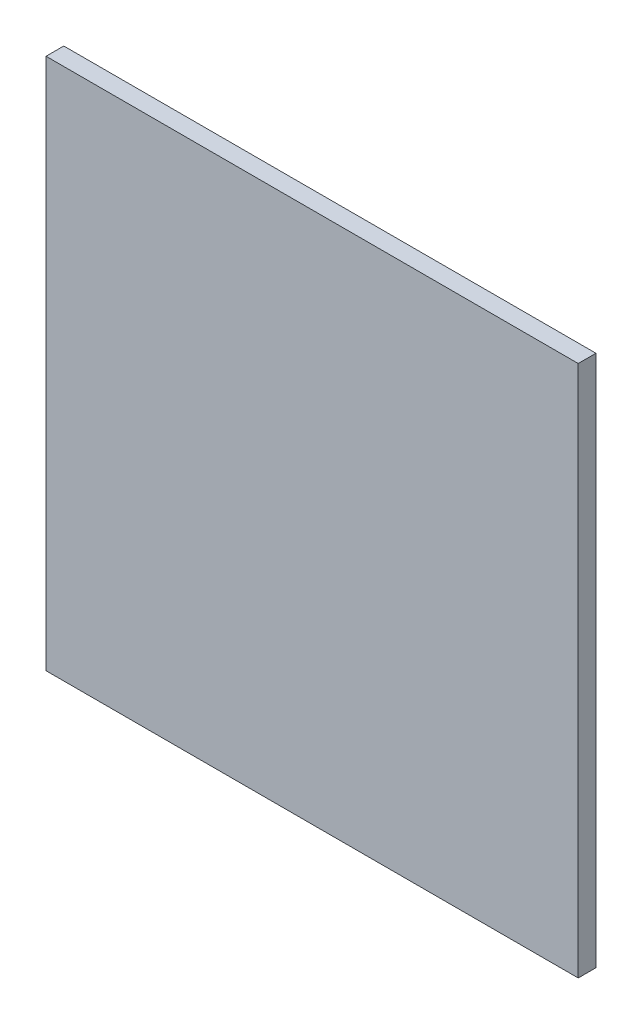
ISO-10303-21;
HEADER;
FILE_DESCRIPTION(('STEP AP214'),'2;1');
FILE_NAME('part.step','',(''),(''),'','','');
FILE_SCHEMA(('AUTOMOTIVE_DESIGN { 1 0 10303 214 1 1 1 1 }'));
ENDSEC;
DATA;
#1=APPLICATION_CONTEXT('core data for automotive mechanical design processes');
#2=APPLICATION_PROTOCOL_DEFINITION('international standard','automotive_design',2000,#1);
#3=PRODUCT_CONTEXT('',#1,'mechanical');
#4=PRODUCT('Part','Part','',(#3));
#5=PRODUCT_RELATED_PRODUCT_CATEGORY('part','',(#4));
#6=PRODUCT_DEFINITION_FORMATION('','',#4);
#7=PRODUCT_DEFINITION_CONTEXT('part definition',#1,'design');
#8=PRODUCT_DEFINITION('design','',#6,#7);
#9=PRODUCT_DEFINITION_SHAPE('','',#8);
#10=(LENGTH_UNIT() NAMED_UNIT(*) SI_UNIT(.MILLI.,.METRE.));
#11=(NAMED_UNIT(*) PLANE_ANGLE_UNIT() SI_UNIT($,.RADIAN.));
#12=(NAMED_UNIT(*) SI_UNIT($,.STERADIAN.) SOLID_ANGLE_UNIT());
#13=UNCERTAINTY_MEASURE_WITH_UNIT(LENGTH_MEASURE(1.E-05),#10,'distance_accuracy_value','');
#14=(GEOMETRIC_REPRESENTATION_CONTEXT(3) GLOBAL_UNCERTAINTY_ASSIGNED_CONTEXT((#13)) GLOBAL_UNIT_ASSIGNED_CONTEXT((#10,
#11,#12)) REPRESENTATION_CONTEXT('',''));
#15=CARTESIAN_POINT('',(0.,0.,0.));
#16=DIRECTION('',(0.,0.,1.));
#17=DIRECTION('',(1.,0.,0.));
#18=AXIS2_PLACEMENT_3D('',#15,#16,#17);
#19=CARTESIAN_POINT('',(900.,900.,60.));
#20=DIRECTION('',(-1.,0.,0.));
#21=DIRECTION('',(0.,-1.,0.));
#22=AXIS2_PLACEMENT_3D('',#19,#20,#21);
#23=PLANE('',#22);
#24=DIRECTION('',(0.,1.,0.));
#25=VECTOR('',#24,1.);
#26=CARTESIAN_POINT('',(900.,900.,0.));
#27=LINE('',#26,#25);
#28=CARTESIAN_POINT('',(900.,-900.,0.));
#29=VERTEX_POINT('',#28);
#30=CARTESIAN_POINT('',(900.,900.,0.));
#31=VERTEX_POINT('',#30);
#32=EDGE_CURVE('E102',#29,#31,#27,.T.);
#33=ORIENTED_EDGE('',*,*,#32,.T.);
#34=DIRECTION('',(0.,0.,-1.));
#35=VECTOR('',#34,1.);
#36=CARTESIAN_POINT('',(900.,900.,60.));
#37=LINE('',#36,#35);
#38=CARTESIAN_POINT('',(900.,900.,60.));
#39=VERTEX_POINT('',#38);
#40=EDGE_CURVE('E11',#39,#31,#37,.T.);
#41=ORIENTED_EDGE('',*,*,#40,.F.);
#42=DIRECTION('',(0.,1.,0.));
#43=VECTOR('',#42,1.);
#44=CARTESIAN_POINT('',(900.,900.,60.));
#45=LINE('',#44,#43);
#46=CARTESIAN_POINT('',(900.,-900.,60.));
#47=VERTEX_POINT('',#46);
#48=EDGE_CURVE('E90',#47,#39,#45,.T.);
#49=ORIENTED_EDGE('',*,*,#48,.F.);
#50=DIRECTION('',(0.,0.,-1.));
#51=VECTOR('',#50,1.);
#52=CARTESIAN_POINT('',(900.,-900.,60.));
#53=LINE('',#52,#51);
#54=EDGE_CURVE('E98',#47,#29,#53,.T.);
#55=ORIENTED_EDGE('',*,*,#54,.T.);
#56=EDGE_LOOP('',(#33,#41,#49,#55));
#57=FACE_BOUND('',#56,.T.);
#58=ADVANCED_FACE('F39',(#57),#23,.F.);
#59=CARTESIAN_POINT('',(-900.,900.,60.));
#60=DIRECTION('',(0.,-1.,0.));
#61=DIRECTION('',(0.,0.,-1.));
#62=AXIS2_PLACEMENT_3D('',#59,#60,#61);
#63=PLANE('',#62);
#64=DIRECTION('',(-1.,0.,0.));
#65=VECTOR('',#64,1.);
#66=CARTESIAN_POINT('',(-900.,900.,0.));
#67=LINE('',#66,#65);
#68=CARTESIAN_POINT('',(-900.,900.,0.));
#69=VERTEX_POINT('',#68);
#70=EDGE_CURVE('E94',#31,#69,#67,.T.);
#71=ORIENTED_EDGE('',*,*,#70,.T.);
#72=DIRECTION('',(0.,0.,-1.));
#73=VECTOR('',#72,1.);
#74=CARTESIAN_POINT('',(-900.,900.,60.));
#75=LINE('',#74,#73);
#76=CARTESIAN_POINT('',(-900.,900.,60.));
#77=VERTEX_POINT('',#76);
#78=EDGE_CURVE('E47',#77,#69,#75,.T.);
#79=ORIENTED_EDGE('',*,*,#78,.F.);
#80=DIRECTION('',(-1.,0.,0.));
#81=VECTOR('',#80,1.);
#82=CARTESIAN_POINT('',(-900.,900.,60.));
#83=LINE('',#82,#81);
#84=EDGE_CURVE('E85',#39,#77,#83,.T.);
#85=ORIENTED_EDGE('',*,*,#84,.F.);
#86=ORIENTED_EDGE('',*,*,#40,.T.);
#87=EDGE_LOOP('',(#71,#79,#85,#86));
#88=FACE_BOUND('',#87,.T.);
#89=ADVANCED_FACE('F93',(#88),#63,.F.);
#90=CARTESIAN_POINT('',(-900.,900.,60.));
#91=DIRECTION('',(1.,0.,0.));
#92=DIRECTION('',(0.,1.,0.));
#93=AXIS2_PLACEMENT_3D('',#90,#91,#92);
#94=PLANE('',#93);
#95=DIRECTION('',(0.,-1.,0.));
#96=VECTOR('',#95,1.);
#97=CARTESIAN_POINT('',(-900.,900.,0.));
#98=LINE('',#97,#96);
#99=CARTESIAN_POINT('',(-900.,-900.,0.));
#100=VERTEX_POINT('',#99);
#101=EDGE_CURVE('E72',#69,#100,#98,.T.);
#102=ORIENTED_EDGE('',*,*,#101,.T.);
#103=DIRECTION('',(0.,0.,-1.));
#104=VECTOR('',#103,1.);
#105=CARTESIAN_POINT('',(-900.,-900.,60.));
#106=LINE('',#105,#104);
#107=CARTESIAN_POINT('',(-900.,-900.,60.));
#108=VERTEX_POINT('',#107);
#109=EDGE_CURVE('E95',#108,#100,#106,.T.);
#110=ORIENTED_EDGE('',*,*,#109,.F.);
#111=DIRECTION('',(0.,-1.,0.));
#112=VECTOR('',#111,1.);
#113=CARTESIAN_POINT('',(-900.,900.,60.));
#114=LINE('',#113,#112);
#115=EDGE_CURVE('E88',#77,#108,#114,.T.);
#116=ORIENTED_EDGE('',*,*,#115,.F.);
#117=ORIENTED_EDGE('',*,*,#78,.T.);
#118=EDGE_LOOP('',(#102,#110,#116,#117));
#119=FACE_BOUND('',#118,.T.);
#120=ADVANCED_FACE('F96',(#119),#94,.F.);
#121=CARTESIAN_POINT('',(-900.,-900.,60.));
#122=DIRECTION('',(0.,1.,0.));
#123=DIRECTION('',(0.,0.,1.));
#124=AXIS2_PLACEMENT_3D('',#121,#122,#123);
#125=PLANE('',#124);
#126=DIRECTION('',(1.,0.,0.));
#127=VECTOR('',#126,1.);
#128=CARTESIAN_POINT('',(-900.,-900.,0.));
#129=LINE('',#128,#127);
#130=EDGE_CURVE('E78',#100,#29,#129,.T.);
#131=ORIENTED_EDGE('',*,*,#130,.T.);
#132=ORIENTED_EDGE('',*,*,#54,.F.);
#133=DIRECTION('',(1.,0.,0.));
#134=VECTOR('',#133,1.);
#135=CARTESIAN_POINT('',(-900.,-900.,60.));
#136=LINE('',#135,#134);
#137=EDGE_CURVE('E55',#108,#47,#136,.T.);
#138=ORIENTED_EDGE('',*,*,#137,.F.);
#139=ORIENTED_EDGE('',*,*,#109,.T.);
#140=EDGE_LOOP('',(#131,#132,#138,#139));
#141=FACE_BOUND('',#140,.T.);
#142=ADVANCED_FACE('F109',(#141),#125,.F.);
#143=CARTESIAN_POINT('',(0.,0.,60.));
#144=DIRECTION('',(0.,0.,1.));
#145=DIRECTION('',(1.,0.,0.));
#146=AXIS2_PLACEMENT_3D('',#143,#144,#145);
#147=PLANE('',#146);
#148=ORIENTED_EDGE('',*,*,#48,.T.);
#149=ORIENTED_EDGE('',*,*,#84,.T.);
#150=ORIENTED_EDGE('',*,*,#115,.T.);
#151=ORIENTED_EDGE('',*,*,#137,.T.);
#152=EDGE_LOOP('',(#148,#149,#150,#151));
#153=FACE_BOUND('',#152,.T.);
#154=ADVANCED_FACE('F86',(#153),#147,.T.);
#155=CARTESIAN_POINT('',(0.,0.,0.));
#156=DIRECTION('',(0.,0.,1.));
#157=DIRECTION('',(1.,0.,0.));
#158=AXIS2_PLACEMENT_3D('',#155,#156,#157);
#159=PLANE('',#158);
#160=ORIENTED_EDGE('',*,*,#32,.F.);
#161=ORIENTED_EDGE('',*,*,#130,.F.);
#162=ORIENTED_EDGE('',*,*,#101,.F.);
#163=ORIENTED_EDGE('',*,*,#70,.F.);
#164=EDGE_LOOP('',(#160,#161,#162,#163));
#165=FACE_BOUND('',#164,.T.);
#166=ADVANCED_FACE('F112',(#165),#159,.F.);
#167=CLOSED_SHELL('',(#58,#89,#120,#142,#154,#166));
#168=MANIFOLD_SOLID_BREP('B2',#167);
#169=ADVANCED_BREP_SHAPE_REPRESENTATION('',(#18,#168),#14);
#170=SHAPE_DEFINITION_REPRESENTATION(#9,#169);
ENDSEC;
END-ISO-10303-21;
